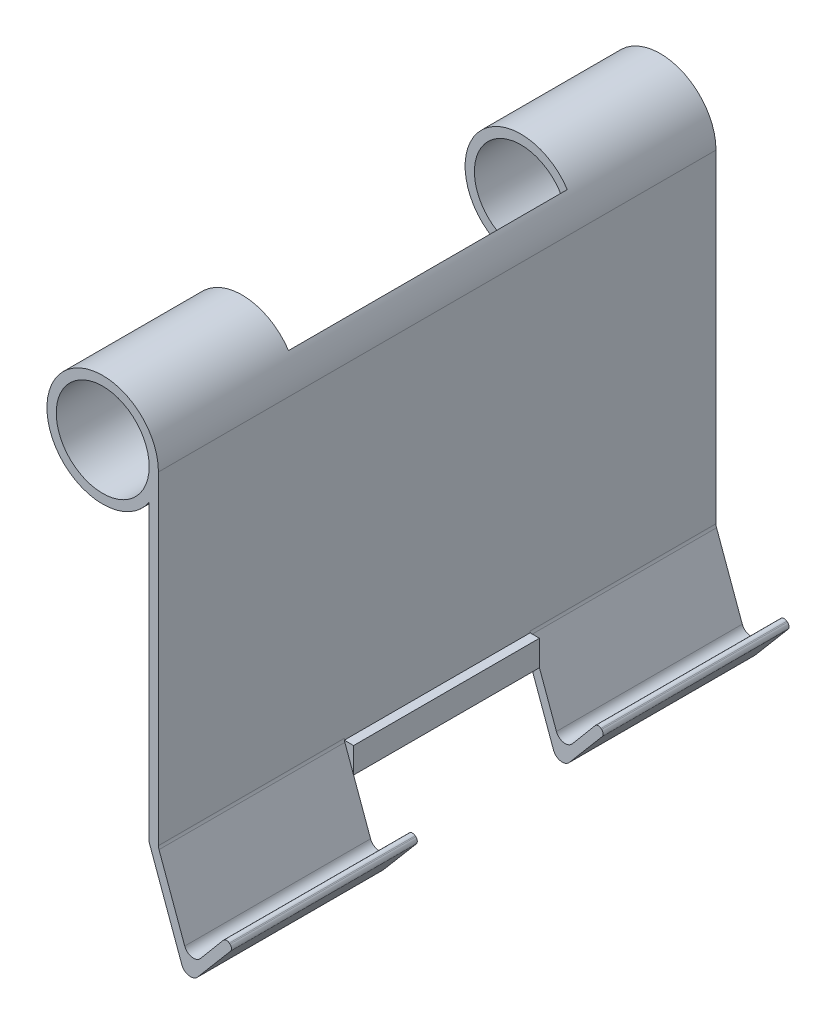
ISO-10303-21;
HEADER;
FILE_DESCRIPTION(('STEP AP214'),'2;1');
FILE_NAME('part.step','',(''),(''),'','','');
FILE_SCHEMA(('AUTOMOTIVE_DESIGN { 1 0 10303 214 1 1 1 1 }'));
ENDSEC;
DATA;
#1=APPLICATION_CONTEXT('core data for automotive mechanical design processes');
#2=APPLICATION_PROTOCOL_DEFINITION('international standard','automotive_design',2000,#1);
#3=PRODUCT_CONTEXT('',#1,'mechanical');
#4=PRODUCT('Part','Part','',(#3));
#5=PRODUCT_RELATED_PRODUCT_CATEGORY('part','',(#4));
#6=PRODUCT_DEFINITION_FORMATION('','',#4);
#7=PRODUCT_DEFINITION_CONTEXT('part definition',#1,'design');
#8=PRODUCT_DEFINITION('design','',#6,#7);
#9=PRODUCT_DEFINITION_SHAPE('','',#8);
#10=(LENGTH_UNIT() NAMED_UNIT(*) SI_UNIT(.MILLI.,.METRE.));
#11=(NAMED_UNIT(*) PLANE_ANGLE_UNIT() SI_UNIT($,.RADIAN.));
#12=(NAMED_UNIT(*) SI_UNIT($,.STERADIAN.) SOLID_ANGLE_UNIT());
#13=UNCERTAINTY_MEASURE_WITH_UNIT(LENGTH_MEASURE(1.E-05),#10,'distance_accuracy_value','');
#14=(GEOMETRIC_REPRESENTATION_CONTEXT(3) GLOBAL_UNCERTAINTY_ASSIGNED_CONTEXT((#13)) GLOBAL_UNIT_ASSIGNED_CONTEXT((#10,
#11,#12)) REPRESENTATION_CONTEXT('',''));
#15=CARTESIAN_POINT('',(0.,0.,0.));
#16=DIRECTION('',(0.,0.,1.));
#17=DIRECTION('',(1.,0.,0.));
#18=AXIS2_PLACEMENT_3D('',#15,#16,#17);
#19=CARTESIAN_POINT('',(2.54000000000001,0.,152.4));
#20=DIRECTION('',(-1.,0.,0.));
#21=DIRECTION('',(0.,-1.,0.));
#22=AXIS2_PLACEMENT_3D('',#19,#20,#21);
#23=PLANE('',#22);
#24=DIRECTION('',(0.,0.,1.));
#25=VECTOR('',#24,1.);
#26=CARTESIAN_POINT('',(2.54000000000001,-88.8864950510241,101.6));
#27=LINE('',#26,#25);
#28=CARTESIAN_POINT('',(2.54000000000001,-88.8864950510241,50.8));
#29=VERTEX_POINT('',#28);
#30=CARTESIAN_POINT('',(2.54000000000001,-88.8864950510241,101.6));
#31=VERTEX_POINT('',#30);
#32=EDGE_CURVE('E272',#29,#31,#27,.T.);
#33=ORIENTED_EDGE('',*,*,#32,.F.);
#34=DIRECTION('',(0.,1.,0.));
#35=VECTOR('',#34,1.);
#36=CARTESIAN_POINT('',(2.54000000000001,-44.45,50.8));
#37=LINE('',#36,#35);
#38=CARTESIAN_POINT('',(2.54000000000001,-88.4521294690005,50.8));
#39=VERTEX_POINT('',#38);
#40=EDGE_CURVE('E316',#29,#39,#37,.T.);
#41=ORIENTED_EDGE('',*,*,#40,.T.);
#42=DIRECTION('',(0.,0.,-1.));
#43=VECTOR('',#42,1.);
#44=CARTESIAN_POINT('',(2.54000000000001,-88.4521294690005,152.4));
#45=LINE('',#44,#43);
#46=CARTESIAN_POINT('',(2.54000000000001,-88.4521294690005,0.));
#47=VERTEX_POINT('',#46);
#48=EDGE_CURVE('E387',#39,#47,#45,.T.);
#49=ORIENTED_EDGE('',*,*,#48,.T.);
#50=DIRECTION('',(0.,1.,0.));
#51=VECTOR('',#50,1.);
#52=CARTESIAN_POINT('',(2.54000000000001,0.,0.));
#53=LINE('',#52,#51);
#54=CARTESIAN_POINT('',(2.54000000000001,0.,0.));
#55=VERTEX_POINT('',#54);
#56=EDGE_CURVE('E334',#47,#55,#53,.T.);
#57=ORIENTED_EDGE('',*,*,#56,.T.);
#58=DIRECTION('',(0.,0.,-1.));
#59=VECTOR('',#58,1.);
#60=CARTESIAN_POINT('',(2.54000000000001,0.,152.4));
#61=LINE('',#60,#59);
#62=CARTESIAN_POINT('',(2.54000000000001,0.,152.4));
#63=VERTEX_POINT('',#62);
#64=EDGE_CURVE('E355',#63,#55,#61,.T.);
#65=ORIENTED_EDGE('',*,*,#64,.F.);
#66=DIRECTION('',(0.,1.,0.));
#67=VECTOR('',#66,1.);
#68=CARTESIAN_POINT('',(2.54000000000001,0.,152.4));
#69=LINE('',#68,#67);
#70=CARTESIAN_POINT('',(2.54000000000001,-88.4521294690005,152.4));
#71=VERTEX_POINT('',#70);
#72=EDGE_CURVE('E353',#71,#63,#69,.T.);
#73=ORIENTED_EDGE('',*,*,#72,.F.);
#74=DIRECTION('',(0.,0.,-1.));
#75=VECTOR('',#74,1.);
#76=CARTESIAN_POINT('',(2.54000000000001,-88.4521294690005,152.4));
#77=LINE('',#76,#75);
#78=CARTESIAN_POINT('',(2.54000000000001,-88.4521294690005,101.6));
#79=VERTEX_POINT('',#78);
#80=EDGE_CURVE('E390',#71,#79,#77,.T.);
#81=ORIENTED_EDGE('',*,*,#80,.T.);
#82=DIRECTION('',(0.,-1.,0.));
#83=VECTOR('',#82,1.);
#84=CARTESIAN_POINT('',(2.54000000000001,-44.45,101.6));
#85=LINE('',#84,#83);
#86=EDGE_CURVE('E314',#79,#31,#85,.T.);
#87=ORIENTED_EDGE('',*,*,#86,.T.);
#88=EDGE_LOOP('',(#33,#41,#49,#57,#65,#73,#81,#87));
#89=FACE_BOUND('',#88,.T.);
#90=ADVANCED_FACE('F35',(#89),#23,.F.);
#91=CARTESIAN_POINT('',(22.9701476976169,-44.45,101.6));
#92=DIRECTION('',(0.,0.,-1.));
#93=DIRECTION('',(0.,1.,0.));
#94=AXIS2_PLACEMENT_3D('',#91,#92,#93);
#95=PLANE('',#94);
#96=DIRECTION('',(0.342020143325663,-0.939692620785911,0.));
#97=VECTOR('',#96,1.);
#98=CARTESIAN_POINT('',(-11.5989577771656,-57.0321254180294,101.6));
#99=LINE('',#98,#97);
#100=CARTESIAN_POINT('',(2.54000000000001,-95.8785926454149,101.6));
#101=VERTEX_POINT('',#100);
#102=CARTESIAN_POINT('',(8.92778565856479,-113.428889502638,101.6));
#103=VERTEX_POINT('',#102);
#104=EDGE_CURVE('E303',#101,#103,#99,.T.);
#105=ORIENTED_EDGE('',*,*,#104,.F.);
#106=DIRECTION('',(-1.,0.,0.));
#107=VECTOR('',#106,1.);
#108=CARTESIAN_POINT('',(5.08000000000001,-95.8785926454149,101.6));
#109=LINE('',#108,#107);
#110=CARTESIAN_POINT('',(5.08000000000001,-95.8785926454149,101.6));
#111=VERTEX_POINT('',#110);
#112=EDGE_CURVE('E50',#111,#101,#109,.T.);
#113=ORIENTED_EDGE('',*,*,#112,.F.);
#114=DIRECTION('',(0.342020143325663,-0.93969262078591,0.));
#115=VECTOR('',#114,1.);
#116=CARTESIAN_POINT('',(-9.35608133440446,-56.2157851537275,101.6));
#117=LINE('',#116,#115);
#118=CARTESIAN_POINT('',(9.72262512622366,-108.634100346707,101.6));
#119=VERTEX_POINT('',#118);
#120=EDGE_CURVE('E296',#111,#119,#117,.T.);
#121=ORIENTED_EDGE('',*,*,#120,.T.);
#122=CARTESIAN_POINT('',(12.1094443830199,-107.76536918266,101.6));
#123=DIRECTION('',(0.,0.,-1.));
#124=DIRECTION('',(0.,1.,0.));
#125=AXIS2_PLACEMENT_3D('',#122,#123,#124);
#126=CIRCLE('',#125,2.54);
#127=CARTESIAN_POINT('',(14.0551972685421,-109.398049711264,101.6));
#128=VERTEX_POINT('',#127);
#129=EDGE_CURVE('E440',#119,#128,#126,.F.);
#130=ORIENTED_EDGE('',*,*,#129,.T.);
#131=DIRECTION('',(0.642787609686539,0.766044443118978,0.));
#132=VECTOR('',#131,1.);
#133=CARTESIAN_POINT('',(49.719311484417,-66.8952134678047,101.6));
#134=LINE('',#133,#132);
#135=CARTESIAN_POINT('',(20.288688574223,-101.969264053314,101.6));
#136=VERTEX_POINT('',#135);
#137=EDGE_CURVE('E306',#128,#136,#134,.T.);
#138=ORIENTED_EDGE('',*,*,#137,.T.);
#139=CARTESIAN_POINT('',(21.164277372708,-102.703970291186,101.6));
#140=DIRECTION('',(0.,0.,-1.));
#141=DIRECTION('',(0.,1.,0.));
#142=AXIS2_PLACEMENT_3D('',#139,#140,#141);
#143=CIRCLE('',#142,1.143);
#144=CARTESIAN_POINT('',(21.8989836105797,-101.828381492701,101.6));
#145=VERTEX_POINT('',#144);
#146=EDGE_CURVE('E467',#136,#145,#143,.T.);
#147=ORIENTED_EDGE('',*,*,#146,.T.);
#148=DIRECTION('',(0.766044443118977,-0.642787609686541,0.));
#149=VECTOR('',#148,1.);
#150=CARTESIAN_POINT('',(-5.72576897470545,-78.6484617870241,101.6));
#151=LINE('',#150,#149);
#152=CARTESIAN_POINT('',(22.0896557893056,-101.988374447545,101.6));
#153=VERTEX_POINT('',#152);
#154=EDGE_CURVE('E309',#145,#153,#151,.T.);
#155=ORIENTED_EDGE('',*,*,#154,.T.);
#156=CARTESIAN_POINT('',(21.3549495514339,-102.86396324603,101.6));
#157=DIRECTION('',(0.,0.,-1.));
#158=DIRECTION('',(0.,1.,0.));
#159=AXIS2_PLACEMENT_3D('',#156,#157,#158);
#160=CIRCLE('',#159,1.143);
#161=CARTESIAN_POINT('',(22.2272618907807,-103.602556627143,101.6));
#162=VERTEX_POINT('',#161);
#163=EDGE_CURVE('E469',#153,#162,#160,.T.);
#164=ORIENTED_EDGE('',*,*,#163,.T.);
#165=DIRECTION('',(-0.646188434919109,-0.763177899691017,0.));
#166=VECTOR('',#165,1.);
#167=CARTESIAN_POINT('',(51.7089424611329,-68.7833524427482,101.6));
#168=LINE('',#167,#166);
#169=CARTESIAN_POINT('',(13.2530767805762,-114.201476963285,101.6));
#170=VERTEX_POINT('',#169);
#171=EDGE_CURVE('E312',#162,#170,#168,.T.);
#172=ORIENTED_EDGE('',*,*,#171,.T.);
#173=CARTESIAN_POINT('',(11.314604915361,-112.560158338591,101.6));
#174=DIRECTION('',(0.,0.,-1.));
#175=DIRECTION('',(0.,1.,0.));
#176=AXIS2_PLACEMENT_3D('',#173,#174,#175);
#177=CIRCLE('',#176,2.54);
#178=EDGE_CURVE('E422',#170,#103,#177,.T.);
#179=ORIENTED_EDGE('',*,*,#178,.T.);
#180=EDGE_LOOP('',(#105,#113,#121,#130,#138,#147,#155,#164,#172,#179));
#181=FACE_BOUND('',#180,.T.);
#182=ADVANCED_FACE('F529',(#181),#95,.T.);
#183=CARTESIAN_POINT('',(5.08000000000001,-88.4521294690005,101.6));
#184=DIRECTION('',(0.,0.,-1.));
#185=DIRECTION('',(0.,1.,0.));
#186=AXIS2_PLACEMENT_3D('',#183,#184,#185);
#187=CIRCLE('',#186,2.54);
#188=CARTESIAN_POINT('',(2.57741602715249,-88.8864950510241,101.6));
#189=VERTEX_POINT('',#188);
#190=EDGE_CURVE('E428',#79,#189,#187,.F.);
#191=ORIENTED_EDGE('',*,*,#190,.T.);
#192=DIRECTION('',(-1.,0.,0.));
#193=VECTOR('',#192,1.);
#194=CARTESIAN_POINT('',(5.08000000000001,-88.8864950510241,101.6));
#195=LINE('',#194,#193);
#196=EDGE_CURVE('E58',#189,#31,#195,.T.);
#197=ORIENTED_EDGE('',*,*,#196,.T.);
#198=ORIENTED_EDGE('',*,*,#86,.F.);
#199=EDGE_LOOP('',(#191,#197,#198));
#200=FACE_BOUND('',#199,.T.);
#201=ADVANCED_FACE('F580',(#200),#95,.T.);
#202=CARTESIAN_POINT('',(22.9701476976169,-44.45,50.8));
#203=DIRECTION('',(0.,0.,1.));
#204=DIRECTION('',(0.,-1.,0.));
#205=AXIS2_PLACEMENT_3D('',#202,#203,#204);
#206=PLANE('',#205);
#207=DIRECTION('',(-0.342020143325663,0.93969262078591,0.));
#208=VECTOR('',#207,1.);
#209=CARTESIAN_POINT('',(-9.35608133440446,-56.2157851537275,50.8));
#210=LINE('',#209,#208);
#211=CARTESIAN_POINT('',(9.72262512622366,-108.634100346707,50.8));
#212=VERTEX_POINT('',#211);
#213=CARTESIAN_POINT('',(5.08000000000001,-95.8785926454149,50.8));
#214=VERTEX_POINT('',#213);
#215=EDGE_CURVE('E293',#212,#214,#210,.T.);
#216=ORIENTED_EDGE('',*,*,#215,.T.);
#217=DIRECTION('',(-1.,0.,0.));
#218=VECTOR('',#217,1.);
#219=CARTESIAN_POINT('',(5.08000000000001,-95.8785926454149,50.8));
#220=LINE('',#219,#218);
#221=CARTESIAN_POINT('',(2.54000000000001,-95.8785926454149,50.8));
#222=VERTEX_POINT('',#221);
#223=EDGE_CURVE('E260',#214,#222,#220,.T.);
#224=ORIENTED_EDGE('',*,*,#223,.T.);
#225=DIRECTION('',(-0.342020143325663,0.939692620785911,0.));
#226=VECTOR('',#225,1.);
#227=CARTESIAN_POINT('',(-11.5989577771656,-57.0321254180294,50.8));
#228=LINE('',#227,#226);
#229=CARTESIAN_POINT('',(8.92778565856479,-113.428889502638,50.8));
#230=VERTEX_POINT('',#229);
#231=EDGE_CURVE('E300',#230,#222,#228,.T.);
#232=ORIENTED_EDGE('',*,*,#231,.F.);
#233=CARTESIAN_POINT('',(11.314604915361,-112.560158338591,50.8));
#234=DIRECTION('',(0.,0.,1.));
#235=DIRECTION('',(0.,-1.,0.));
#236=AXIS2_PLACEMENT_3D('',#233,#234,#235);
#237=CIRCLE('',#236,2.54);
#238=CARTESIAN_POINT('',(13.2530767805762,-114.201476963285,50.8));
#239=VERTEX_POINT('',#238);
#240=EDGE_CURVE('E417',#230,#239,#237,.T.);
#241=ORIENTED_EDGE('',*,*,#240,.T.);
#242=DIRECTION('',(0.646188434919109,0.763177899691017,0.));
#243=VECTOR('',#242,1.);
#244=CARTESIAN_POINT('',(51.7089424611329,-68.7833524427482,50.8));
#245=LINE('',#244,#243);
#246=CARTESIAN_POINT('',(22.2272618907807,-103.602556627143,50.8));
#247=VERTEX_POINT('',#246);
#248=EDGE_CURVE('E326',#239,#247,#245,.T.);
#249=ORIENTED_EDGE('',*,*,#248,.T.);
#250=CARTESIAN_POINT('',(21.3549495514339,-102.86396324603,50.8));
#251=DIRECTION('',(0.,0.,1.));
#252=DIRECTION('',(0.,-1.,0.));
#253=AXIS2_PLACEMENT_3D('',#250,#251,#252);
#254=CIRCLE('',#253,1.143);
#255=CARTESIAN_POINT('',(22.0896557893056,-101.988374447545,50.8));
#256=VERTEX_POINT('',#255);
#257=EDGE_CURVE('E457',#247,#256,#254,.T.);
#258=ORIENTED_EDGE('',*,*,#257,.T.);
#259=DIRECTION('',(-0.766044443118977,0.642787609686541,0.));
#260=VECTOR('',#259,1.);
#261=CARTESIAN_POINT('',(-5.72576897470545,-78.6484617870241,50.8));
#262=LINE('',#261,#260);
#263=CARTESIAN_POINT('',(21.8989836105797,-101.828381492701,50.8));
#264=VERTEX_POINT('',#263);
#265=EDGE_CURVE('E323',#256,#264,#262,.T.);
#266=ORIENTED_EDGE('',*,*,#265,.T.);
#267=CARTESIAN_POINT('',(21.164277372708,-102.703970291186,50.8));
#268=DIRECTION('',(0.,0.,1.));
#269=DIRECTION('',(0.,-1.,0.));
#270=AXIS2_PLACEMENT_3D('',#267,#268,#269);
#271=CIRCLE('',#270,1.143);
#272=CARTESIAN_POINT('',(20.288688574223,-101.969264053314,50.8));
#273=VERTEX_POINT('',#272);
#274=EDGE_CURVE('E455',#264,#273,#271,.T.);
#275=ORIENTED_EDGE('',*,*,#274,.T.);
#276=DIRECTION('',(-0.642787609686539,-0.766044443118978,0.));
#277=VECTOR('',#276,1.);
#278=CARTESIAN_POINT('',(49.719311484417,-66.8952134678047,50.8));
#279=LINE('',#278,#277);
#280=CARTESIAN_POINT('',(14.0551972685421,-109.398049711264,50.8));
#281=VERTEX_POINT('',#280);
#282=EDGE_CURVE('E321',#273,#281,#279,.T.);
#283=ORIENTED_EDGE('',*,*,#282,.T.);
#284=CARTESIAN_POINT('',(12.1094443830199,-107.76536918266,50.8));
#285=DIRECTION('',(0.,0.,1.));
#286=DIRECTION('',(0.,-1.,0.));
#287=AXIS2_PLACEMENT_3D('',#284,#285,#286);
#288=CIRCLE('',#287,2.54);
#289=EDGE_CURVE('E438',#281,#212,#288,.F.);
#290=ORIENTED_EDGE('',*,*,#289,.T.);
#291=EDGE_LOOP('',(#216,#224,#232,#241,#249,#258,#266,#275,#283,#290));
#292=FACE_BOUND('',#291,.T.);
#293=ADVANCED_FACE('F619',(#292),#206,.T.);
#294=ORIENTED_EDGE('',*,*,#40,.F.);
#295=DIRECTION('',(-1.,0.,0.));
#296=VECTOR('',#295,1.);
#297=CARTESIAN_POINT('',(5.08000000000001,-88.8864950510241,50.8));
#298=LINE('',#297,#296);
#299=CARTESIAN_POINT('',(2.57741602715249,-88.8864950510241,50.8));
#300=VERTEX_POINT('',#299);
#301=EDGE_CURVE('E261',#300,#29,#298,.T.);
#302=ORIENTED_EDGE('',*,*,#301,.F.);
#303=CARTESIAN_POINT('',(5.08000000000001,-88.4521294690005,50.8));
#304=DIRECTION('',(0.,0.,1.));
#305=DIRECTION('',(0.,-1.,0.));
#306=AXIS2_PLACEMENT_3D('',#303,#304,#305);
#307=CIRCLE('',#306,2.54);
#308=EDGE_CURVE('E434',#300,#39,#307,.F.);
#309=ORIENTED_EDGE('',*,*,#308,.T.);
#310=EDGE_LOOP('',(#294,#302,#309));
#311=FACE_BOUND('',#310,.T.);
#312=ADVANCED_FACE('F571',(#311),#206,.T.);
#313=CARTESIAN_POINT('',(-12.7,0.,152.4));
#314=DIRECTION('',(0.,0.,-1.));
#315=DIRECTION('',(-1.,0.,0.));
#316=AXIS2_PLACEMENT_3D('',#313,#314,#315);
#317=CYLINDRICAL_SURFACE('',#316,15.24);
#318=DIRECTION('',(0.,0.,-1.));
#319=VECTOR('',#318,1.);
#320=CARTESIAN_POINT('',(0.,-8.42422696750274,152.4));
#321=LINE('',#320,#319);
#322=CARTESIAN_POINT('',(0.,-8.42422696750274,38.1));
#323=VERTEX_POINT('',#322);
#324=CARTESIAN_POINT('',(0.,-8.42422696750274,0.));
#325=VERTEX_POINT('',#324);
#326=EDGE_CURVE('E383',#323,#325,#321,.T.);
#327=ORIENTED_EDGE('',*,*,#326,.F.);
#328=CARTESIAN_POINT('',(-12.7,0.,38.1));
#329=DIRECTION('',(0.,0.,1.));
#330=DIRECTION('',(1.,0.,0.));
#331=AXIS2_PLACEMENT_3D('',#328,#329,#330);
#332=CIRCLE('',#331,15.24);
#333=CARTESIAN_POINT('',(0.,8.42422696750274,38.1));
#334=VERTEX_POINT('',#333);
#335=EDGE_CURVE('E289',#334,#323,#332,.T.);
#336=ORIENTED_EDGE('',*,*,#335,.F.);
#337=DIRECTION('',(0.,0.,-1.));
#338=VECTOR('',#337,1.);
#339=CARTESIAN_POINT('',(0.,8.42422696750274,152.4));
#340=LINE('',#339,#338);
#341=CARTESIAN_POINT('',(0.,8.42422696750274,114.3));
#342=VERTEX_POINT('',#341);
#343=EDGE_CURVE('E287',#342,#334,#340,.T.);
#344=ORIENTED_EDGE('',*,*,#343,.F.);
#345=CARTESIAN_POINT('',(-12.7,0.,114.3));
#346=DIRECTION('',(0.,0.,-1.));
#347=DIRECTION('',(-1.,0.,0.));
#348=AXIS2_PLACEMENT_3D('',#345,#346,#347);
#349=CIRCLE('',#348,15.24);
#350=CARTESIAN_POINT('',(0.,-8.42422696750274,114.3));
#351=VERTEX_POINT('',#350);
#352=EDGE_CURVE('E291',#351,#342,#349,.T.);
#353=ORIENTED_EDGE('',*,*,#352,.F.);
#354=CARTESIAN_POINT('',(0.,-8.42422696750274,152.4));
#355=VERTEX_POINT('',#354);
#356=EDGE_CURVE('E384',#355,#351,#321,.T.);
#357=ORIENTED_EDGE('',*,*,#356,.F.);
#358=CARTESIAN_POINT('',(-12.7,0.,152.4));
#359=DIRECTION('',(0.,0.,1.));
#360=DIRECTION('',(1.,0.,0.));
#361=AXIS2_PLACEMENT_3D('',#358,#359,#360);
#362=CIRCLE('',#361,15.24);
#363=EDGE_CURVE('E333',#63,#355,#362,.T.);
#364=ORIENTED_EDGE('',*,*,#363,.F.);
#365=ORIENTED_EDGE('',*,*,#64,.T.);
#366=CARTESIAN_POINT('',(-12.7,0.,0.));
#367=DIRECTION('',(0.,0.,1.));
#368=DIRECTION('',(1.,0.,0.));
#369=AXIS2_PLACEMENT_3D('',#366,#367,#368);
#370=CIRCLE('',#369,15.24);
#371=EDGE_CURVE('E358',#55,#325,#370,.T.);
#372=ORIENTED_EDGE('',*,*,#371,.T.);
#373=EDGE_LOOP('',(#327,#336,#344,#353,#357,#364,#365,#372));
#374=FACE_BOUND('',#373,.T.);
#375=ADVANCED_FACE('F493',(#374),#317,.T.);
#376=CARTESIAN_POINT('',(-12.7,0.,152.4));
#377=DIRECTION('',(0.,0.,-1.));
#378=DIRECTION('',(-1.,0.,0.));
#379=AXIS2_PLACEMENT_3D('',#376,#377,#378);
#380=CYLINDRICAL_SURFACE('',#379,12.7);
#381=CARTESIAN_POINT('',(-12.7,0.,152.4));
#382=DIRECTION('',(0.,0.,1.));
#383=DIRECTION('',(1.,0.,0.));
#384=AXIS2_PLACEMENT_3D('',#381,#382,#383);
#385=CIRCLE('',#384,12.7);
#386=CARTESIAN_POINT('',(0.,0.,152.4));
#387=VERTEX_POINT('',#386);
#388=EDGE_CURVE('E330',#387,#387,#385,.T.);
#389=ORIENTED_EDGE('',*,*,#388,.T.);
#390=EDGE_LOOP('',(#389));
#391=FACE_BOUND('',#390,.T.);
#392=CARTESIAN_POINT('',(-12.7,0.,114.3));
#393=DIRECTION('',(0.,0.,-1.));
#394=DIRECTION('',(-1.,0.,0.));
#395=AXIS2_PLACEMENT_3D('',#392,#393,#394);
#396=CIRCLE('',#395,12.7);
#397=CARTESIAN_POINT('',(0.,0.,114.3));
#398=VERTEX_POINT('',#397);
#399=EDGE_CURVE('E11',#398,#398,#396,.T.);
#400=ORIENTED_EDGE('',*,*,#399,.T.);
#401=EDGE_LOOP('',(#400));
#402=FACE_BOUND('',#401,.T.);
#403=ADVANCED_FACE('F562',(#391,#402),#380,.F.);
#404=CARTESIAN_POINT('',(-12.7,0.,0.));
#405=DIRECTION('',(0.,0.,1.));
#406=DIRECTION('',(1.,0.,0.));
#407=AXIS2_PLACEMENT_3D('',#404,#405,#406);
#408=CIRCLE('',#407,12.7);
#409=CARTESIAN_POINT('',(0.,0.,0.));
#410=VERTEX_POINT('',#409);
#411=EDGE_CURVE('E329',#410,#410,#408,.T.);
#412=ORIENTED_EDGE('',*,*,#411,.F.);
#413=EDGE_LOOP('',(#412));
#414=FACE_BOUND('',#413,.T.);
#415=CARTESIAN_POINT('',(-12.7,0.,38.1));
#416=DIRECTION('',(0.,0.,1.));
#417=DIRECTION('',(1.,0.,0.));
#418=AXIS2_PLACEMENT_3D('',#415,#416,#417);
#419=CIRCLE('',#418,12.7);
#420=CARTESIAN_POINT('',(0.,0.,38.1));
#421=VERTEX_POINT('',#420);
#422=EDGE_CURVE('E43',#421,#421,#419,.T.);
#423=ORIENTED_EDGE('',*,*,#422,.T.);
#424=EDGE_LOOP('',(#423));
#425=FACE_BOUND('',#424,.T.);
#426=ADVANCED_FACE('F482',(#414,#425),#380,.F.);
#427=CARTESIAN_POINT('',(-28.5719092505662,-10.3993245033611,152.4));
#428=DIRECTION('',(0.93969262078591,0.342020143325663,0.));
#429=DIRECTION('',(-0.342020143325663,0.939692620785911,0.));
#430=AXIS2_PLACEMENT_3D('',#427,#428,#429);
#431=PLANE('',#430);
#432=DIRECTION('',(0.342020143325663,-0.939692620785911,0.));
#433=VECTOR('',#432,1.);
#434=CARTESIAN_POINT('',(-28.5719092505662,-10.3993245033611,0.));
#435=LINE('',#434,#433);
#436=CARTESIAN_POINT('',(0.,-88.9,0.));
#437=VERTEX_POINT('',#436);
#438=CARTESIAN_POINT('',(8.92778565856479,-113.428889502638,0.));
#439=VERTEX_POINT('',#438);
#440=EDGE_CURVE('E363',#437,#439,#435,.T.);
#441=ORIENTED_EDGE('',*,*,#440,.T.);
#442=DIRECTION('',(0.,0.,-1.));
#443=VECTOR('',#442,1.);
#444=CARTESIAN_POINT('',(8.92778565856479,-113.428889502638,50.8));
#445=LINE('',#444,#443);
#446=EDGE_CURVE('E415',#439,#230,#445,.F.);
#447=ORIENTED_EDGE('',*,*,#446,.T.);
#448=ORIENTED_EDGE('',*,*,#231,.T.);
#449=DIRECTION('',(0.,0.,1.));
#450=VECTOR('',#449,1.);
#451=CARTESIAN_POINT('',(2.54000000000001,-95.8785926454149,0.));
#452=LINE('',#451,#450);
#453=EDGE_CURVE('E318',#222,#101,#452,.T.);
#454=ORIENTED_EDGE('',*,*,#453,.T.);
#455=ORIENTED_EDGE('',*,*,#104,.T.);
#456=DIRECTION('',(0.,0.,-1.));
#457=VECTOR('',#456,1.);
#458=CARTESIAN_POINT('',(8.92778565856479,-113.428889502638,152.4));
#459=LINE('',#458,#457);
#460=CARTESIAN_POINT('',(8.92778565856479,-113.428889502638,152.4));
#461=VERTEX_POINT('',#460);
#462=EDGE_CURVE('E413',#103,#461,#459,.F.);
#463=ORIENTED_EDGE('',*,*,#462,.T.);
#464=DIRECTION('',(0.342020143325663,-0.939692620785911,0.));
#465=VECTOR('',#464,1.);
#466=CARTESIAN_POINT('',(-28.5719092505662,-10.3993245033611,152.4));
#467=LINE('',#466,#465);
#468=CARTESIAN_POINT('',(0.,-88.9,152.4));
#469=VERTEX_POINT('',#468);
#470=EDGE_CURVE('E339',#469,#461,#467,.T.);
#471=ORIENTED_EDGE('',*,*,#470,.F.);
#472=DIRECTION('',(0.,0.,-1.));
#473=VECTOR('',#472,1.);
#474=CARTESIAN_POINT('',(0.,-88.9,152.4));
#475=LINE('',#474,#473);
#476=EDGE_CURVE('E380',#469,#437,#475,.T.);
#477=ORIENTED_EDGE('',*,*,#476,.T.);
#478=EDGE_LOOP('',(#441,#447,#448,#454,#455,#463,#471,#477));
#479=FACE_BOUND('',#478,.T.);
#480=ADVANCED_FACE('F505',(#479),#431,.F.);
#481=CARTESIAN_POINT('',(64.0383559872269,-54.2217549105294,152.4));
#482=DIRECTION('',(0.763177899691017,-0.646188434919109,0.));
#483=DIRECTION('',(0.646188434919109,0.763177899691017,0.));
#484=AXIS2_PLACEMENT_3D('',#481,#482,#483);
#485=PLANE('',#484);
#486=ORIENTED_EDGE('',*,*,#171,.F.);
#487=DIRECTION('',(0.,0.,-1.));
#488=VECTOR('',#487,1.);
#489=CARTESIAN_POINT('',(22.2272618907807,-103.602556627143,152.4));
#490=LINE('',#489,#488);
#491=CARTESIAN_POINT('',(22.2272618907807,-103.602556627143,152.4));
#492=VERTEX_POINT('',#491);
#493=EDGE_CURVE('E471',#162,#492,#490,.F.);
#494=ORIENTED_EDGE('',*,*,#493,.T.);
#495=DIRECTION('',(-0.646188434919109,-0.763177899691017,0.));
#496=VECTOR('',#495,1.);
#497=CARTESIAN_POINT('',(64.0383559872269,-54.2217549105294,152.4));
#498=LINE('',#497,#496);
#499=CARTESIAN_POINT('',(13.2530767805762,-114.201476963285,152.4));
#500=VERTEX_POINT('',#499);
#501=EDGE_CURVE('E342',#492,#500,#498,.T.);
#502=ORIENTED_EDGE('',*,*,#501,.T.);
#503=DIRECTION('',(0.,0.,-1.));
#504=VECTOR('',#503,1.);
#505=CARTESIAN_POINT('',(13.2530767805762,-114.201476963285,101.6));
#506=LINE('',#505,#504);
#507=EDGE_CURVE('E419',#500,#170,#506,.T.);
#508=ORIENTED_EDGE('',*,*,#507,.T.);
#509=EDGE_LOOP('',(#486,#494,#502,#508));
#510=FACE_BOUND('',#509,.T.);
#511=ADVANCED_FACE('F518',(#510),#485,.T.);
#512=DIRECTION('',(-0.646188434919109,-0.763177899691017,0.));
#513=VECTOR('',#512,1.);
#514=CARTESIAN_POINT('',(64.0383559872269,-54.2217549105294,0.));
#515=LINE('',#514,#513);
#516=CARTESIAN_POINT('',(22.2272618907807,-103.602556627143,0.));
#517=VERTEX_POINT('',#516);
#518=CARTESIAN_POINT('',(13.2530767805762,-114.201476963285,0.));
#519=VERTEX_POINT('',#518);
#520=EDGE_CURVE('E366',#517,#519,#515,.T.);
#521=ORIENTED_EDGE('',*,*,#520,.F.);
#522=DIRECTION('',(0.,0.,-1.));
#523=VECTOR('',#522,1.);
#524=CARTESIAN_POINT('',(22.2272618907807,-103.602556627143,152.4));
#525=LINE('',#524,#523);
#526=EDGE_CURVE('E453',#517,#247,#525,.F.);
#527=ORIENTED_EDGE('',*,*,#526,.T.);
#528=ORIENTED_EDGE('',*,*,#248,.F.);
#529=DIRECTION('',(0.,0.,-1.));
#530=VECTOR('',#529,1.);
#531=CARTESIAN_POINT('',(13.2530767805762,-114.201476963285,0.));
#532=LINE('',#531,#530);
#533=EDGE_CURVE('E408',#239,#519,#532,.T.);
#534=ORIENTED_EDGE('',*,*,#533,.T.);
#535=EDGE_LOOP('',(#521,#527,#528,#534));
#536=FACE_BOUND('',#535,.T.);
#537=ADVANCED_FACE('F594',(#536),#485,.T.);
#538=CARTESIAN_POINT('',(-41.0925572784259,-48.9722027654473,152.4));
#539=DIRECTION('',(0.64278760968654,0.766044443118977,0.));
#540=DIRECTION('',(-0.766044443118977,0.642787609686541,0.));
#541=AXIS2_PLACEMENT_3D('',#538,#539,#540);
#542=PLANE('',#541);
#543=DIRECTION('',(0.766044443118977,-0.642787609686541,0.));
#544=VECTOR('',#543,1.);
#545=CARTESIAN_POINT('',(-41.0925572784259,-48.9722027654473,152.4));
#546=LINE('',#545,#544);
#547=CARTESIAN_POINT('',(21.8989836105797,-101.828381492701,152.4));
#548=VERTEX_POINT('',#547);
#549=CARTESIAN_POINT('',(22.0896557893056,-101.988374447545,152.4));
#550=VERTEX_POINT('',#549);
#551=EDGE_CURVE('E344',#548,#550,#546,.T.);
#552=ORIENTED_EDGE('',*,*,#551,.T.);
#553=DIRECTION('',(0.,0.,-1.));
#554=VECTOR('',#553,1.);
#555=CARTESIAN_POINT('',(22.0896557893056,-101.988374447545,152.4));
#556=LINE('',#555,#554);
#557=EDGE_CURVE('E464',#550,#153,#556,.T.);
#558=ORIENTED_EDGE('',*,*,#557,.T.);
#559=ORIENTED_EDGE('',*,*,#154,.F.);
#560=DIRECTION('',(0.,0.,-1.));
#561=VECTOR('',#560,1.);
#562=CARTESIAN_POINT('',(21.8989836105797,-101.828381492701,152.4));
#563=LINE('',#562,#561);
#564=EDGE_CURVE('E462',#145,#548,#563,.F.);
#565=ORIENTED_EDGE('',*,*,#564,.T.);
#566=EDGE_LOOP('',(#552,#558,#559,#565));
#567=FACE_BOUND('',#566,.T.);
#568=ADVANCED_FACE('F527',(#567),#542,.T.);
#569=ORIENTED_EDGE('',*,*,#265,.F.);
#570=DIRECTION('',(0.,0.,-1.));
#571=VECTOR('',#570,1.);
#572=CARTESIAN_POINT('',(22.0896557893056,-101.988374447545,152.4));
#573=LINE('',#572,#571);
#574=CARTESIAN_POINT('',(22.0896557893056,-101.988374447545,0.));
#575=VERTEX_POINT('',#574);
#576=EDGE_CURVE('E446',#256,#575,#573,.T.);
#577=ORIENTED_EDGE('',*,*,#576,.T.);
#578=DIRECTION('',(0.766044443118977,-0.642787609686541,0.));
#579=VECTOR('',#578,1.);
#580=CARTESIAN_POINT('',(-41.0925572784259,-48.9722027654473,0.));
#581=LINE('',#580,#579);
#582=CARTESIAN_POINT('',(21.8989836105797,-101.828381492701,0.));
#583=VERTEX_POINT('',#582);
#584=EDGE_CURVE('E368',#583,#575,#581,.T.);
#585=ORIENTED_EDGE('',*,*,#584,.F.);
#586=DIRECTION('',(0.,0.,-1.));
#587=VECTOR('',#586,1.);
#588=CARTESIAN_POINT('',(21.8989836105797,-101.828381492701,152.4));
#589=LINE('',#588,#587);
#590=EDGE_CURVE('E444',#583,#264,#589,.F.);
#591=ORIENTED_EDGE('',*,*,#590,.T.);
#592=EDGE_LOOP('',(#569,#577,#585,#591));
#593=FACE_BOUND('',#592,.T.);
#594=ADVANCED_FACE('F591',(#593),#542,.T.);
#595=CARTESIAN_POINT('',(62.1159520905206,-52.1214724893814,152.4));
#596=DIRECTION('',(-0.766044443118978,0.642787609686539,0.));
#597=DIRECTION('',(-0.642787609686539,-0.766044443118978,0.));
#598=AXIS2_PLACEMENT_3D('',#595,#596,#597);
#599=PLANE('',#598);
#600=DIRECTION('',(0.642787609686539,0.766044443118978,0.));
#601=VECTOR('',#600,1.);
#602=CARTESIAN_POINT('',(62.1159520905206,-52.1214724893814,152.4));
#603=LINE('',#602,#601);
#604=CARTESIAN_POINT('',(14.0551972685421,-109.398049711264,152.4));
#605=VERTEX_POINT('',#604);
#606=CARTESIAN_POINT('',(20.288688574223,-101.969264053314,152.4));
#607=VERTEX_POINT('',#606);
#608=EDGE_CURVE('E347',#605,#607,#603,.T.);
#609=ORIENTED_EDGE('',*,*,#608,.T.);
#610=DIRECTION('',(0.,0.,-1.));
#611=VECTOR('',#610,1.);
#612=CARTESIAN_POINT('',(20.288688574223,-101.969264053314,152.4));
#613=LINE('',#612,#611);
#614=EDGE_CURVE('E477',#607,#136,#613,.T.);
#615=ORIENTED_EDGE('',*,*,#614,.T.);
#616=ORIENTED_EDGE('',*,*,#137,.F.);
#617=DIRECTION('',(0.,0.,-1.));
#618=VECTOR('',#617,1.);
#619=CARTESIAN_POINT('',(14.0551972685421,-109.398049711264,152.4));
#620=LINE('',#619,#618);
#621=EDGE_CURVE('E406',#128,#605,#620,.F.);
#622=ORIENTED_EDGE('',*,*,#621,.T.);
#623=EDGE_LOOP('',(#609,#615,#616,#622));
#624=FACE_BOUND('',#623,.T.);
#625=ADVANCED_FACE('F535',(#624),#599,.T.);
#626=ORIENTED_EDGE('',*,*,#282,.F.);
#627=DIRECTION('',(0.,0.,-1.));
#628=VECTOR('',#627,1.);
#629=CARTESIAN_POINT('',(20.288688574223,-101.969264053314,152.4));
#630=LINE('',#629,#628);
#631=CARTESIAN_POINT('',(20.288688574223,-101.969264053314,0.));
#632=VERTEX_POINT('',#631);
#633=EDGE_CURVE('E459',#273,#632,#630,.T.);
#634=ORIENTED_EDGE('',*,*,#633,.T.);
#635=DIRECTION('',(0.642787609686539,0.766044443118978,0.));
#636=VECTOR('',#635,1.);
#637=CARTESIAN_POINT('',(62.1159520905206,-52.1214724893814,0.));
#638=LINE('',#637,#636);
#639=CARTESIAN_POINT('',(14.0551972685421,-109.398049711264,0.));
#640=VERTEX_POINT('',#639);
#641=EDGE_CURVE('E371',#640,#632,#638,.T.);
#642=ORIENTED_EDGE('',*,*,#641,.F.);
#643=DIRECTION('',(0.,0.,-1.));
#644=VECTOR('',#643,1.);
#645=CARTESIAN_POINT('',(14.0551972685421,-109.398049711264,50.8));
#646=LINE('',#645,#644);
#647=EDGE_CURVE('E403',#640,#281,#646,.F.);
#648=ORIENTED_EDGE('',*,*,#647,.T.);
#649=EDGE_LOOP('',(#626,#634,#642,#648));
#650=FACE_BOUND('',#649,.T.);
#651=ADVANCED_FACE('F588',(#650),#599,.T.);
#652=CARTESIAN_POINT('',(-26.3290328078051,-9.58298423905919,152.4));
#653=DIRECTION('',(0.93969262078591,0.342020143325663,0.));
#654=DIRECTION('',(-0.342020143325663,0.93969262078591,0.));
#655=AXIS2_PLACEMENT_3D('',#652,#653,#654);
#656=PLANE('',#655);
#657=CARTESIAN_POINT('',(2.6931807432038,-89.3208606330477,101.6));
#658=VERTEX_POINT('',#657);
#659=EDGE_CURVE('E297',#658,#111,#117,.T.);
#660=ORIENTED_EDGE('',*,*,#659,.F.);
#661=DIRECTION('',(0.,0.,-1.));
#662=VECTOR('',#661,1.);
#663=CARTESIAN_POINT('',(2.6931807432038,-89.3208606330477,152.4));
#664=LINE('',#663,#662);
#665=CARTESIAN_POINT('',(2.69318074320381,-89.3208606330477,152.4));
#666=VERTEX_POINT('',#665);
#667=EDGE_CURVE('E396',#658,#666,#664,.F.);
#668=ORIENTED_EDGE('',*,*,#667,.T.);
#669=DIRECTION('',(0.342020143325663,-0.939692620785911,0.));
#670=VECTOR('',#669,1.);
#671=CARTESIAN_POINT('',(-26.3290328078051,-9.58298423905919,152.4));
#672=LINE('',#671,#670);
#673=CARTESIAN_POINT('',(9.72262512622367,-108.634100346707,152.4));
#674=VERTEX_POINT('',#673);
#675=EDGE_CURVE('E350',#666,#674,#672,.T.);
#676=ORIENTED_EDGE('',*,*,#675,.T.);
#677=DIRECTION('',(0.,0.,-1.));
#678=VECTOR('',#677,1.);
#679=CARTESIAN_POINT('',(9.72262512622366,-108.634100346707,101.6));
#680=LINE('',#679,#678);
#681=EDGE_CURVE('E393',#674,#119,#680,.T.);
#682=ORIENTED_EDGE('',*,*,#681,.T.);
#683=ORIENTED_EDGE('',*,*,#120,.F.);
#684=EDGE_LOOP('',(#660,#668,#676,#682,#683));
#685=FACE_BOUND('',#684,.T.);
#686=ADVANCED_FACE('F545',(#685),#656,.T.);
#687=DIRECTION('',(0.342020143325663,-0.939692620785911,0.));
#688=VECTOR('',#687,1.);
#689=CARTESIAN_POINT('',(-26.3290328078051,-9.58298423905919,0.));
#690=LINE('',#689,#688);
#691=CARTESIAN_POINT('',(2.69318074320381,-89.3208606330477,0.));
#692=VERTEX_POINT('',#691);
#693=CARTESIAN_POINT('',(9.72262512622367,-108.634100346707,0.));
#694=VERTEX_POINT('',#693);
#695=EDGE_CURVE('E374',#692,#694,#690,.T.);
#696=ORIENTED_EDGE('',*,*,#695,.F.);
#697=DIRECTION('',(0.,0.,-1.));
#698=VECTOR('',#697,1.);
#699=CARTESIAN_POINT('',(2.6931807432038,-89.3208606330477,152.4));
#700=LINE('',#699,#698);
#701=CARTESIAN_POINT('',(2.6931807432038,-89.3208606330477,50.8));
#702=VERTEX_POINT('',#701);
#703=EDGE_CURVE('E401',#692,#702,#700,.F.);
#704=ORIENTED_EDGE('',*,*,#703,.T.);
#705=DIRECTION('',(0.342020143325663,-0.93969262078591,0.));
#706=VECTOR('',#705,1.);
#707=CARTESIAN_POINT('',(-26.3290328078051,-9.58298423905919,50.8));
#708=LINE('',#707,#706);
#709=EDGE_CURVE('E277',#702,#214,#708,.T.);
#710=ORIENTED_EDGE('',*,*,#709,.T.);
#711=ORIENTED_EDGE('',*,*,#215,.F.);
#712=DIRECTION('',(0.,0.,-1.));
#713=VECTOR('',#712,1.);
#714=CARTESIAN_POINT('',(9.72262512622366,-108.634100346707,0.));
#715=LINE('',#714,#713);
#716=EDGE_CURVE('E398',#212,#694,#715,.T.);
#717=ORIENTED_EDGE('',*,*,#716,.T.);
#718=EDGE_LOOP('',(#696,#704,#710,#711,#717));
#719=FACE_BOUND('',#718,.T.);
#720=ADVANCED_FACE('F587',(#719),#656,.T.);
#721=CARTESIAN_POINT('',(0.,0.,152.4));
#722=DIRECTION('',(1.,0.,0.));
#723=DIRECTION('',(0.,1.,0.));
#724=AXIS2_PLACEMENT_3D('',#721,#722,#723);
#725=PLANE('',#724);
#726=ORIENTED_EDGE('',*,*,#356,.T.);
#727=DIRECTION('',(0.,1.,0.));
#728=VECTOR('',#727,1.);
#729=CARTESIAN_POINT('',(0.,45.72,114.3));
#730=LINE('',#729,#728);
#731=EDGE_CURVE('E282',#351,#398,#730,.T.);
#732=ORIENTED_EDGE('',*,*,#731,.T.);
#733=EDGE_CURVE('E279',#398,#342,#730,.T.);
#734=ORIENTED_EDGE('',*,*,#733,.T.);
#735=ORIENTED_EDGE('',*,*,#343,.T.);
#736=DIRECTION('',(0.,-1.,0.));
#737=VECTOR('',#736,1.);
#738=CARTESIAN_POINT('',(0.,45.72,38.1));
#739=LINE('',#738,#737);
#740=EDGE_CURVE('E286',#334,#421,#739,.T.);
#741=ORIENTED_EDGE('',*,*,#740,.T.);
#742=EDGE_CURVE('E283',#421,#323,#739,.T.);
#743=ORIENTED_EDGE('',*,*,#742,.T.);
#744=ORIENTED_EDGE('',*,*,#326,.T.);
#745=DIRECTION('',(0.,-1.,0.));
#746=VECTOR('',#745,1.);
#747=CARTESIAN_POINT('',(0.,0.,0.));
#748=LINE('',#747,#746);
#749=EDGE_CURVE('E361',#325,#437,#748,.T.);
#750=ORIENTED_EDGE('',*,*,#749,.T.);
#751=ORIENTED_EDGE('',*,*,#476,.F.);
#752=DIRECTION('',(0.,-1.,0.));
#753=VECTOR('',#752,1.);
#754=CARTESIAN_POINT('',(0.,0.,152.4));
#755=LINE('',#754,#753);
#756=EDGE_CURVE('E337',#355,#469,#755,.T.);
#757=ORIENTED_EDGE('',*,*,#756,.F.);
#758=EDGE_LOOP('',(#726,#732,#734,#735,#741,#743,#744,#750,#751,#757));
#759=FACE_BOUND('',#758,.T.);
#760=ADVANCED_FACE('F490',(#759),#725,.F.);
#761=CARTESIAN_POINT('',(0.,0.,152.4));
#762=DIRECTION('',(0.,0.,1.));
#763=DIRECTION('',(1.,0.,0.));
#764=AXIS2_PLACEMENT_3D('',#761,#762,#763);
#765=PLANE('',#764);
#766=ORIENTED_EDGE('',*,*,#388,.F.);
#767=EDGE_LOOP('',(#766));
#768=FACE_BOUND('',#767,.T.);
#769=ORIENTED_EDGE('',*,*,#501,.F.);
#770=CARTESIAN_POINT('',(21.3549495514339,-102.86396324603,152.4));
#771=DIRECTION('',(0.,0.,1.));
#772=DIRECTION('',(1.,0.,0.));
#773=AXIS2_PLACEMENT_3D('',#770,#771,#772);
#774=CIRCLE('',#773,1.143);
#775=EDGE_CURVE('E475',#492,#550,#774,.T.);
#776=ORIENTED_EDGE('',*,*,#775,.T.);
#777=ORIENTED_EDGE('',*,*,#551,.F.);
#778=CARTESIAN_POINT('',(21.164277372708,-102.703970291186,152.4));
#779=DIRECTION('',(0.,0.,1.));
#780=DIRECTION('',(1.,0.,0.));
#781=AXIS2_PLACEMENT_3D('',#778,#779,#780);
#782=CIRCLE('',#781,1.143);
#783=EDGE_CURVE('E473',#548,#607,#782,.T.);
#784=ORIENTED_EDGE('',*,*,#783,.T.);
#785=ORIENTED_EDGE('',*,*,#608,.F.);
#786=CARTESIAN_POINT('',(12.1094443830199,-107.76536918266,152.4));
#787=DIRECTION('',(0.,0.,1.));
#788=DIRECTION('',(1.,0.,0.));
#789=AXIS2_PLACEMENT_3D('',#786,#787,#788);
#790=CIRCLE('',#789,2.54);
#791=EDGE_CURVE('E442',#605,#674,#790,.F.);
#792=ORIENTED_EDGE('',*,*,#791,.T.);
#793=ORIENTED_EDGE('',*,*,#675,.F.);
#794=CARTESIAN_POINT('',(5.08000000000001,-88.4521294690005,152.4));
#795=DIRECTION('',(0.,0.,1.));
#796=DIRECTION('',(1.,0.,0.));
#797=AXIS2_PLACEMENT_3D('',#794,#795,#796);
#798=CIRCLE('',#797,2.54);
#799=EDGE_CURVE('E430',#666,#71,#798,.F.);
#800=ORIENTED_EDGE('',*,*,#799,.T.);
#801=ORIENTED_EDGE('',*,*,#72,.T.);
#802=ORIENTED_EDGE('',*,*,#363,.T.);
#803=ORIENTED_EDGE('',*,*,#756,.T.);
#804=ORIENTED_EDGE('',*,*,#470,.T.);
#805=CARTESIAN_POINT('',(11.314604915361,-112.560158338591,152.4));
#806=DIRECTION('',(0.,0.,1.));
#807=DIRECTION('',(1.,0.,0.));
#808=AXIS2_PLACEMENT_3D('',#805,#806,#807);
#809=CIRCLE('',#808,2.54);
#810=EDGE_CURVE('E424',#461,#500,#809,.T.);
#811=ORIENTED_EDGE('',*,*,#810,.T.);
#812=EDGE_LOOP('',(#769,#776,#777,#784,#785,#792,#793,#800,#801,#802,#803,#804,#811));
#813=FACE_BOUND('',#812,.T.);
#814=ADVANCED_FACE('F511',(#768,#813),#765,.T.);
#815=CARTESIAN_POINT('',(0.,0.,0.));
#816=DIRECTION('',(0.,0.,1.));
#817=DIRECTION('',(1.,0.,0.));
#818=AXIS2_PLACEMENT_3D('',#815,#816,#817);
#819=PLANE('',#818);
#820=ORIENTED_EDGE('',*,*,#411,.T.);
#821=EDGE_LOOP('',(#820));
#822=FACE_BOUND('',#821,.T.);
#823=ORIENTED_EDGE('',*,*,#584,.T.);
#824=CARTESIAN_POINT('',(21.3549495514339,-102.86396324603,0.));
#825=DIRECTION('',(0.,0.,1.));
#826=DIRECTION('',(1.,0.,0.));
#827=AXIS2_PLACEMENT_3D('',#824,#825,#826);
#828=CIRCLE('',#827,1.143);
#829=EDGE_CURVE('E451',#575,#517,#828,.F.);
#830=ORIENTED_EDGE('',*,*,#829,.T.);
#831=ORIENTED_EDGE('',*,*,#520,.T.);
#832=CARTESIAN_POINT('',(11.314604915361,-112.560158338591,0.));
#833=DIRECTION('',(0.,0.,1.));
#834=DIRECTION('',(1.,0.,0.));
#835=AXIS2_PLACEMENT_3D('',#832,#833,#834);
#836=CIRCLE('',#835,2.54);
#837=EDGE_CURVE('E411',#519,#439,#836,.F.);
#838=ORIENTED_EDGE('',*,*,#837,.T.);
#839=ORIENTED_EDGE('',*,*,#440,.F.);
#840=ORIENTED_EDGE('',*,*,#749,.F.);
#841=ORIENTED_EDGE('',*,*,#371,.F.);
#842=ORIENTED_EDGE('',*,*,#56,.F.);
#843=CARTESIAN_POINT('',(5.08000000000001,-88.4521294690005,0.));
#844=DIRECTION('',(0.,0.,1.));
#845=DIRECTION('',(1.,0.,0.));
#846=AXIS2_PLACEMENT_3D('',#843,#844,#845);
#847=CIRCLE('',#846,2.54);
#848=EDGE_CURVE('E432',#47,#692,#847,.T.);
#849=ORIENTED_EDGE('',*,*,#848,.T.);
#850=ORIENTED_EDGE('',*,*,#695,.T.);
#851=CARTESIAN_POINT('',(12.1094443830199,-107.76536918266,0.));
#852=DIRECTION('',(0.,0.,1.));
#853=DIRECTION('',(1.,0.,0.));
#854=AXIS2_PLACEMENT_3D('',#851,#852,#853);
#855=CIRCLE('',#854,2.54);
#856=EDGE_CURVE('E436',#694,#640,#855,.T.);
#857=ORIENTED_EDGE('',*,*,#856,.T.);
#858=ORIENTED_EDGE('',*,*,#641,.T.);
#859=CARTESIAN_POINT('',(21.164277372708,-102.703970291186,0.));
#860=DIRECTION('',(0.,0.,1.));
#861=DIRECTION('',(1.,0.,0.));
#862=AXIS2_PLACEMENT_3D('',#859,#860,#861);
#863=CIRCLE('',#862,1.143);
#864=EDGE_CURVE('E449',#632,#583,#863,.F.);
#865=ORIENTED_EDGE('',*,*,#864,.T.);
#866=EDGE_LOOP('',(#823,#830,#831,#838,#839,#840,#841,#842,#849,#850,#857,#858,#865));
#867=FACE_BOUND('',#866,.T.);
#868=ADVANCED_FACE('F500',(#822,#867),#819,.F.);
#869=CARTESIAN_POINT('',(5.08000000000001,-88.4521294690005,152.4));
#870=DIRECTION('',(0.,0.,-1.));
#871=DIRECTION('',(-1.,0.,0.));
#872=AXIS2_PLACEMENT_3D('',#869,#870,#871);
#873=CYLINDRICAL_SURFACE('',#872,2.54);
#874=ORIENTED_EDGE('',*,*,#799,.F.);
#875=ORIENTED_EDGE('',*,*,#667,.F.);
#876=EDGE_CURVE('E427',#189,#658,#187,.F.);
#877=ORIENTED_EDGE('',*,*,#876,.F.);
#878=ORIENTED_EDGE('',*,*,#190,.F.);
#879=ORIENTED_EDGE('',*,*,#80,.F.);
#880=EDGE_LOOP('',(#874,#875,#877,#878,#879));
#881=FACE_BOUND('',#880,.T.);
#882=ADVANCED_FACE('F551',(#881),#873,.F.);
#883=CARTESIAN_POINT('',(5.08000000000001,-88.4521294690005,152.4));
#884=DIRECTION('',(0.,0.,-1.));
#885=DIRECTION('',(-1.,0.,0.));
#886=AXIS2_PLACEMENT_3D('',#883,#884,#885);
#887=CYLINDRICAL_SURFACE('',#886,2.54);
#888=EDGE_CURVE('E257',#702,#300,#307,.F.);
#889=ORIENTED_EDGE('',*,*,#888,.F.);
#890=ORIENTED_EDGE('',*,*,#703,.F.);
#891=ORIENTED_EDGE('',*,*,#848,.F.);
#892=ORIENTED_EDGE('',*,*,#48,.F.);
#893=ORIENTED_EDGE('',*,*,#308,.F.);
#894=EDGE_LOOP('',(#889,#890,#891,#892,#893));
#895=FACE_BOUND('',#894,.T.);
#896=ADVANCED_FACE('F614',(#895),#887,.F.);
#897=CARTESIAN_POINT('',(12.1094443830199,-107.76536918266,152.4));
#898=DIRECTION('',(0.,0.,1.));
#899=DIRECTION('',(1.,0.,0.));
#900=AXIS2_PLACEMENT_3D('',#897,#898,#899);
#901=CYLINDRICAL_SURFACE('',#900,2.54);
#902=ORIENTED_EDGE('',*,*,#289,.F.);
#903=ORIENTED_EDGE('',*,*,#647,.F.);
#904=ORIENTED_EDGE('',*,*,#856,.F.);
#905=ORIENTED_EDGE('',*,*,#716,.F.);
#906=EDGE_LOOP('',(#902,#903,#904,#905));
#907=FACE_BOUND('',#906,.T.);
#908=ADVANCED_FACE('F625',(#907),#901,.F.);
#909=CARTESIAN_POINT('',(12.1094443830199,-107.76536918266,152.4));
#910=DIRECTION('',(0.,0.,1.));
#911=DIRECTION('',(1.,0.,0.));
#912=AXIS2_PLACEMENT_3D('',#909,#910,#911);
#913=CYLINDRICAL_SURFACE('',#912,2.54);
#914=ORIENTED_EDGE('',*,*,#791,.F.);
#915=ORIENTED_EDGE('',*,*,#621,.F.);
#916=ORIENTED_EDGE('',*,*,#129,.F.);
#917=ORIENTED_EDGE('',*,*,#681,.F.);
#918=EDGE_LOOP('',(#914,#915,#916,#917));
#919=FACE_BOUND('',#918,.T.);
#920=ADVANCED_FACE('F542',(#919),#913,.F.);
#921=CARTESIAN_POINT('',(11.314604915361,-112.560158338591,152.4));
#922=DIRECTION('',(0.,0.,1.));
#923=DIRECTION('',(1.,0.,0.));
#924=AXIS2_PLACEMENT_3D('',#921,#922,#923);
#925=CYLINDRICAL_SURFACE('',#924,2.54);
#926=ORIENTED_EDGE('',*,*,#240,.F.);
#927=ORIENTED_EDGE('',*,*,#446,.F.);
#928=ORIENTED_EDGE('',*,*,#837,.F.);
#929=ORIENTED_EDGE('',*,*,#533,.F.);
#930=EDGE_LOOP('',(#926,#927,#928,#929));
#931=FACE_BOUND('',#930,.T.);
#932=ADVANCED_FACE('F648',(#931),#925,.T.);
#933=CARTESIAN_POINT('',(11.314604915361,-112.560158338591,152.4));
#934=DIRECTION('',(0.,0.,1.));
#935=DIRECTION('',(1.,0.,0.));
#936=AXIS2_PLACEMENT_3D('',#933,#934,#935);
#937=CYLINDRICAL_SURFACE('',#936,2.54);
#938=ORIENTED_EDGE('',*,*,#810,.F.);
#939=ORIENTED_EDGE('',*,*,#462,.F.);
#940=ORIENTED_EDGE('',*,*,#178,.F.);
#941=ORIENTED_EDGE('',*,*,#507,.F.);
#942=EDGE_LOOP('',(#938,#939,#940,#941));
#943=FACE_BOUND('',#942,.T.);
#944=ADVANCED_FACE('F514',(#943),#937,.T.);
#945=CARTESIAN_POINT('',(21.3549495514339,-102.86396324603,152.4));
#946=DIRECTION('',(0.,0.,-1.));
#947=DIRECTION('',(-1.,0.,0.));
#948=AXIS2_PLACEMENT_3D('',#945,#946,#947);
#949=CYLINDRICAL_SURFACE('',#948,1.143);
#950=ORIENTED_EDGE('',*,*,#257,.F.);
#951=ORIENTED_EDGE('',*,*,#526,.F.);
#952=ORIENTED_EDGE('',*,*,#829,.F.);
#953=ORIENTED_EDGE('',*,*,#576,.F.);
#954=EDGE_LOOP('',(#950,#951,#952,#953));
#955=FACE_BOUND('',#954,.T.);
#956=ADVANCED_FACE('F639',(#955),#949,.T.);
#957=CARTESIAN_POINT('',(21.164277372708,-102.703970291186,152.4));
#958=DIRECTION('',(0.,0.,-1.));
#959=DIRECTION('',(-1.,0.,0.));
#960=AXIS2_PLACEMENT_3D('',#957,#958,#959);
#961=CYLINDRICAL_SURFACE('',#960,1.143);
#962=ORIENTED_EDGE('',*,*,#274,.F.);
#963=ORIENTED_EDGE('',*,*,#590,.F.);
#964=ORIENTED_EDGE('',*,*,#864,.F.);
#965=ORIENTED_EDGE('',*,*,#633,.F.);
#966=EDGE_LOOP('',(#962,#963,#964,#965));
#967=FACE_BOUND('',#966,.T.);
#968=ADVANCED_FACE('F631',(#967),#961,.T.);
#969=CARTESIAN_POINT('',(21.3549495514339,-102.86396324603,152.4));
#970=DIRECTION('',(0.,0.,-1.));
#971=DIRECTION('',(-1.,0.,0.));
#972=AXIS2_PLACEMENT_3D('',#969,#970,#971);
#973=CYLINDRICAL_SURFACE('',#972,1.143);
#974=ORIENTED_EDGE('',*,*,#775,.F.);
#975=ORIENTED_EDGE('',*,*,#493,.F.);
#976=ORIENTED_EDGE('',*,*,#163,.F.);
#977=ORIENTED_EDGE('',*,*,#557,.F.);
#978=EDGE_LOOP('',(#974,#975,#976,#977));
#979=FACE_BOUND('',#978,.T.);
#980=ADVANCED_FACE('F524',(#979),#973,.T.);
#981=CARTESIAN_POINT('',(21.164277372708,-102.703970291186,152.4));
#982=DIRECTION('',(0.,0.,-1.));
#983=DIRECTION('',(-1.,0.,0.));
#984=AXIS2_PLACEMENT_3D('',#981,#982,#983);
#985=CYLINDRICAL_SURFACE('',#984,1.143);
#986=ORIENTED_EDGE('',*,*,#783,.F.);
#987=ORIENTED_EDGE('',*,*,#564,.F.);
#988=ORIENTED_EDGE('',*,*,#146,.F.);
#989=ORIENTED_EDGE('',*,*,#614,.F.);
#990=EDGE_LOOP('',(#986,#987,#988,#989));
#991=FACE_BOUND('',#990,.T.);
#992=ADVANCED_FACE('F37',(#991),#985,.T.);
#993=CARTESIAN_POINT('',(-38.1,45.72,114.3));
#994=DIRECTION('',(0.,0.,-1.));
#995=DIRECTION('',(-1.,0.,0.));
#996=AXIS2_PLACEMENT_3D('',#993,#994,#995);
#997=PLANE('',#996);
#998=ORIENTED_EDGE('',*,*,#352,.T.);
#999=ORIENTED_EDGE('',*,*,#733,.F.);
#1000=ORIENTED_EDGE('',*,*,#399,.F.);
#1001=ORIENTED_EDGE('',*,*,#731,.F.);
#1002=EDGE_LOOP('',(#998,#999,#1000,#1001));
#1003=FACE_BOUND('',#1002,.T.);
#1004=ADVANCED_FACE('F560',(#1003),#997,.T.);
#1005=CARTESIAN_POINT('',(-38.1,45.72,38.1));
#1006=DIRECTION('',(0.,0.,1.));
#1007=DIRECTION('',(1.,0.,0.));
#1008=AXIS2_PLACEMENT_3D('',#1005,#1006,#1007);
#1009=PLANE('',#1008);
#1010=ORIENTED_EDGE('',*,*,#335,.T.);
#1011=ORIENTED_EDGE('',*,*,#742,.F.);
#1012=ORIENTED_EDGE('',*,*,#422,.F.);
#1013=ORIENTED_EDGE('',*,*,#740,.F.);
#1014=EDGE_LOOP('',(#1010,#1011,#1012,#1013));
#1015=FACE_BOUND('',#1014,.T.);
#1016=ADVANCED_FACE('F486',(#1015),#1009,.T.);
#1017=CARTESIAN_POINT('',(5.08000000000001,-95.8785926454149,101.6));
#1018=DIRECTION('',(0.,0.,-1.));
#1019=DIRECTION('',(-1.,0.,0.));
#1020=AXIS2_PLACEMENT_3D('',#1017,#1018,#1019);
#1021=PLANE('',#1020);
#1022=ORIENTED_EDGE('',*,*,#659,.T.);
#1023=DIRECTION('',(0.,-1.,0.));
#1024=VECTOR('',#1023,1.);
#1025=CARTESIAN_POINT('',(5.08000000000001,-95.8785926454149,101.6));
#1026=LINE('',#1025,#1024);
#1027=CARTESIAN_POINT('',(5.08000000000001,-88.8864950510241,101.6));
#1028=VERTEX_POINT('',#1027);
#1029=EDGE_CURVE('E273',#1028,#111,#1026,.T.);
#1030=ORIENTED_EDGE('',*,*,#1029,.F.);
#1031=EDGE_CURVE('E266',#1028,#189,#195,.T.);
#1032=ORIENTED_EDGE('',*,*,#1031,.T.);
#1033=ORIENTED_EDGE('',*,*,#876,.T.);
#1034=EDGE_LOOP('',(#1022,#1030,#1032,#1033));
#1035=FACE_BOUND('',#1034,.T.);
#1036=ADVANCED_FACE('F654',(#1035),#1021,.F.);
#1037=CARTESIAN_POINT('',(5.08000000000001,-95.8785926454149,101.6));
#1038=DIRECTION('',(0.,1.,0.));
#1039=DIRECTION('',(-1.,0.,0.));
#1040=AXIS2_PLACEMENT_3D('',#1037,#1038,#1039);
#1041=PLANE('',#1040);
#1042=ORIENTED_EDGE('',*,*,#453,.F.);
#1043=ORIENTED_EDGE('',*,*,#223,.F.);
#1044=DIRECTION('',(0.,0.,-1.));
#1045=VECTOR('',#1044,1.);
#1046=CARTESIAN_POINT('',(5.08000000000001,-95.8785926454149,101.6));
#1047=LINE('',#1046,#1045);
#1048=EDGE_CURVE('E247',#111,#214,#1047,.T.);
#1049=ORIENTED_EDGE('',*,*,#1048,.F.);
#1050=ORIENTED_EDGE('',*,*,#112,.T.);
#1051=EDGE_LOOP('',(#1042,#1043,#1049,#1050));
#1052=FACE_BOUND('',#1051,.T.);
#1053=ADVANCED_FACE('F651',(#1052),#1041,.F.);
#1054=CARTESIAN_POINT('',(5.08000000000001,-95.8785926454149,50.8));
#1055=DIRECTION('',(0.,0.,1.));
#1056=DIRECTION('',(1.,0.,0.));
#1057=AXIS2_PLACEMENT_3D('',#1054,#1055,#1056);
#1058=PLANE('',#1057);
#1059=ORIENTED_EDGE('',*,*,#709,.F.);
#1060=ORIENTED_EDGE('',*,*,#888,.T.);
#1061=CARTESIAN_POINT('',(5.08000000000001,-88.8864950510241,50.8));
#1062=VERTEX_POINT('',#1061);
#1063=EDGE_CURVE('E254',#1062,#300,#298,.T.);
#1064=ORIENTED_EDGE('',*,*,#1063,.F.);
#1065=DIRECTION('',(0.,1.,0.));
#1066=VECTOR('',#1065,1.);
#1067=CARTESIAN_POINT('',(5.08000000000001,-95.8785926454149,50.8));
#1068=LINE('',#1067,#1066);
#1069=EDGE_CURVE('E239',#214,#1062,#1068,.T.);
#1070=ORIENTED_EDGE('',*,*,#1069,.F.);
#1071=EDGE_LOOP('',(#1059,#1060,#1064,#1070));
#1072=FACE_BOUND('',#1071,.T.);
#1073=ADVANCED_FACE('F255',(#1072),#1058,.F.);
#1074=CARTESIAN_POINT('',(5.08000000000001,-88.8864950510241,101.6));
#1075=DIRECTION('',(0.,-1.,0.));
#1076=DIRECTION('',(1.,0.,0.));
#1077=AXIS2_PLACEMENT_3D('',#1074,#1075,#1076);
#1078=PLANE('',#1077);
#1079=ORIENTED_EDGE('',*,*,#32,.T.);
#1080=ORIENTED_EDGE('',*,*,#196,.F.);
#1081=ORIENTED_EDGE('',*,*,#1031,.F.);
#1082=DIRECTION('',(0.,0.,1.));
#1083=VECTOR('',#1082,1.);
#1084=CARTESIAN_POINT('',(5.08000000000001,-88.8864950510241,101.6));
#1085=LINE('',#1084,#1083);
#1086=EDGE_CURVE('E244',#1062,#1028,#1085,.T.);
#1087=ORIENTED_EDGE('',*,*,#1086,.F.);
#1088=ORIENTED_EDGE('',*,*,#1063,.T.);
#1089=ORIENTED_EDGE('',*,*,#301,.T.);
#1090=EDGE_LOOP('',(#1079,#1080,#1081,#1087,#1088,#1089));
#1091=FACE_BOUND('',#1090,.T.);
#1092=ADVANCED_FACE('F264',(#1091),#1078,.F.);
#1093=CARTESIAN_POINT('',(5.08000000000001,0.,0.));
#1094=DIRECTION('',(-1.,0.,0.));
#1095=DIRECTION('',(0.,0.,1.));
#1096=AXIS2_PLACEMENT_3D('',#1093,#1094,#1095);
#1097=PLANE('',#1096);
#1098=ORIENTED_EDGE('',*,*,#1029,.T.);
#1099=ORIENTED_EDGE('',*,*,#1048,.T.);
#1100=ORIENTED_EDGE('',*,*,#1069,.T.);
#1101=ORIENTED_EDGE('',*,*,#1086,.T.);
#1102=EDGE_LOOP('',(#1098,#1099,#1100,#1101));
#1103=FACE_BOUND('',#1102,.T.);
#1104=ADVANCED_FACE('F242',(#1103),#1097,.F.);
#1105=CLOSED_SHELL('',(#90,#182,#201,#293,#312,#375,#403,#426,#480,#511,#537,#568,#594,#625,
#651,#686,#720,#760,#814,#868,#882,#896,#908,#920,#932,#944,#956,#968,#980,#992,#1004,#1016,
#1036,#1053,#1073,#1092,#1104));
#1106=MANIFOLD_SOLID_BREP('B2',#1105);
#1107=ADVANCED_BREP_SHAPE_REPRESENTATION('',(#18,#1106),#14);
#1108=SHAPE_DEFINITION_REPRESENTATION(#9,#1107);
ENDSEC;
END-ISO-10303-21;
